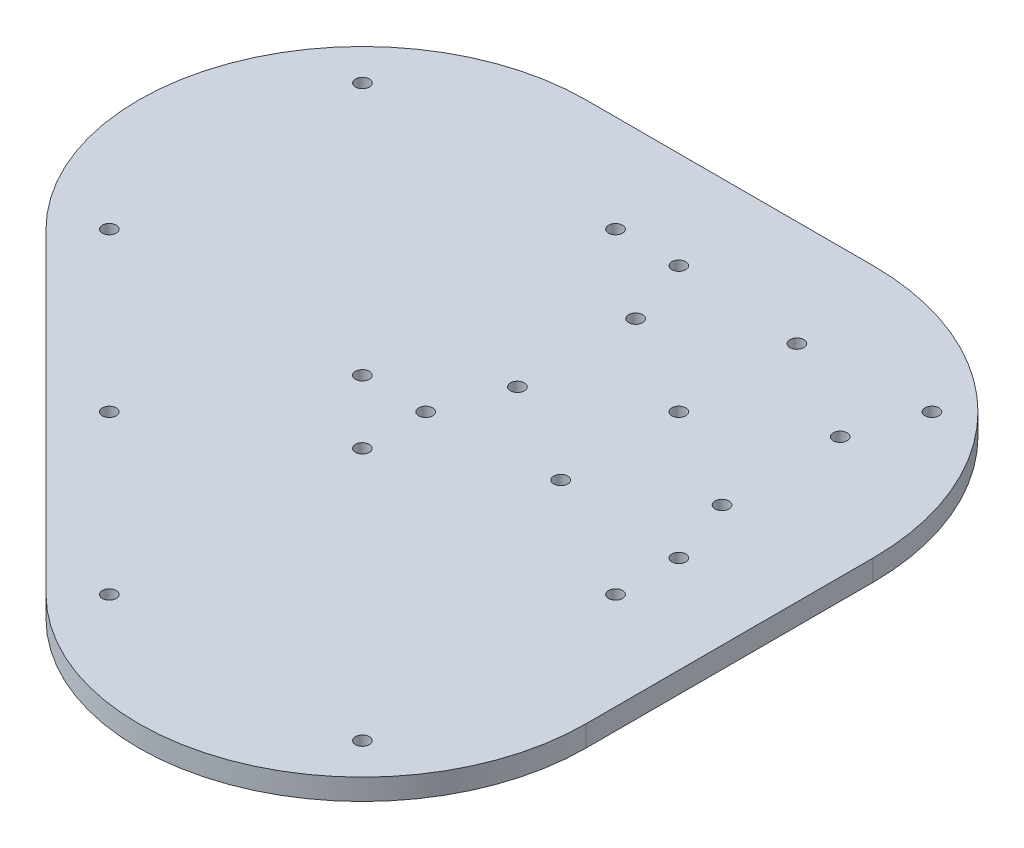
ISO-10303-21;
HEADER;
FILE_DESCRIPTION(('STEP AP214'),'2;1');
FILE_NAME('part.step','',(''),(''),'','','');
FILE_SCHEMA(('AUTOMOTIVE_DESIGN { 1 0 10303 214 1 1 1 1 }'));
ENDSEC;
DATA;
#1=APPLICATION_CONTEXT('core data for automotive mechanical design processes');
#2=APPLICATION_PROTOCOL_DEFINITION('international standard','automotive_design',2000,#1);
#3=PRODUCT_CONTEXT('',#1,'mechanical');
#4=PRODUCT('Part','Part','',(#3));
#5=PRODUCT_RELATED_PRODUCT_CATEGORY('part','',(#4));
#6=PRODUCT_DEFINITION_FORMATION('','',#4);
#7=PRODUCT_DEFINITION_CONTEXT('part definition',#1,'design');
#8=PRODUCT_DEFINITION('design','',#6,#7);
#9=PRODUCT_DEFINITION_SHAPE('','',#8);
#10=(LENGTH_UNIT() NAMED_UNIT(*) SI_UNIT(.MILLI.,.METRE.));
#11=(NAMED_UNIT(*) PLANE_ANGLE_UNIT() SI_UNIT($,.RADIAN.));
#12=(NAMED_UNIT(*) SI_UNIT($,.STERADIAN.) SOLID_ANGLE_UNIT());
#13=UNCERTAINTY_MEASURE_WITH_UNIT(LENGTH_MEASURE(1.E-05),#10,'distance_accuracy_value','');
#14=(GEOMETRIC_REPRESENTATION_CONTEXT(3) GLOBAL_UNCERTAINTY_ASSIGNED_CONTEXT((#13)) GLOBAL_UNIT_ASSIGNED_CONTEXT((#10,
#11,#12)) REPRESENTATION_CONTEXT('',''));
#15=CARTESIAN_POINT('',(0.,0.,0.));
#16=DIRECTION('',(0.,0.,1.));
#17=DIRECTION('',(1.,0.,0.));
#18=AXIS2_PLACEMENT_3D('',#15,#16,#17);
#19=CARTESIAN_POINT('',(37.5,5.,37.5));
#20=DIRECTION('',(0.,1.,0.));
#21=DIRECTION('',(0.,0.,1.));
#22=AXIS2_PLACEMENT_3D('',#19,#20,#21);
#23=PLANE('',#22);
#24=CARTESIAN_POINT('',(-29.9999999999999,5.,30.));
#25=DIRECTION('',(0.,1.,0.));
#26=DIRECTION('',(0.,0.,1.));
#27=AXIS2_PLACEMENT_3D('',#24,#25,#26);
#28=CIRCLE('',#27,1.65);
#29=CARTESIAN_POINT('',(-29.9999999999999,5.,31.65));
#30=VERTEX_POINT('',#29);
#31=EDGE_CURVE('E259',#30,#30,#28,.T.);
#32=ORIENTED_EDGE('',*,*,#31,.F.);
#33=EDGE_LOOP('',(#32));
#34=FACE_BOUND('',#33,.T.);
#35=CARTESIAN_POINT('',(67.5,5.,7.49999999999988));
#36=DIRECTION('',(0.,1.,0.));
#37=DIRECTION('',(0.,0.,-1.));
#38=AXIS2_PLACEMENT_3D('',#35,#36,#37);
#39=CIRCLE('',#38,1.65000000000003);
#40=CARTESIAN_POINT('',(67.5,5.,5.84999999999985));
#41=VERTEX_POINT('',#40);
#42=EDGE_CURVE('E247',#41,#41,#39,.T.);
#43=ORIENTED_EDGE('',*,*,#42,.F.);
#44=EDGE_LOOP('',(#43));
#45=FACE_BOUND('',#44,.T.);
#46=CARTESIAN_POINT('',(7.49999999999999,5.,67.4999999999999));
#47=DIRECTION('',(0.,1.,0.));
#48=DIRECTION('',(0.,0.,-1.));
#49=AXIS2_PLACEMENT_3D('',#46,#47,#48);
#50=CIRCLE('',#49,1.65);
#51=CARTESIAN_POINT('',(7.49999999999999,5.,65.8499999999999));
#52=VERTEX_POINT('',#51);
#53=EDGE_CURVE('E235',#52,#52,#50,.T.);
#54=ORIENTED_EDGE('',*,*,#53,.F.);
#55=EDGE_LOOP('',(#54));
#56=FACE_BOUND('',#55,.T.);
#57=CARTESIAN_POINT('',(-67.4999999999999,5.,-7.49999999999998));
#58=DIRECTION('',(0.,1.,0.));
#59=DIRECTION('',(0.,0.,1.));
#60=AXIS2_PLACEMENT_3D('',#57,#58,#59);
#61=CIRCLE('',#60,1.65);
#62=CARTESIAN_POINT('',(-67.4999999999999,5.,-5.84999999999998));
#63=VERTEX_POINT('',#62);
#64=EDGE_CURVE('E223',#63,#63,#61,.T.);
#65=ORIENTED_EDGE('',*,*,#64,.F.);
#66=EDGE_LOOP('',(#65));
#67=FACE_BOUND('',#66,.T.);
#68=CARTESIAN_POINT('',(-67.4999999999999,5.,-67.5));
#69=DIRECTION('',(0.,1.,0.));
#70=DIRECTION('',(0.,0.,1.));
#71=AXIS2_PLACEMENT_3D('',#68,#69,#70);
#72=CIRCLE('',#71,1.65);
#73=CARTESIAN_POINT('',(-67.4999999999999,5.,-65.85));
#74=VERTEX_POINT('',#73);
#75=EDGE_CURVE('E211',#74,#74,#72,.T.);
#76=ORIENTED_EDGE('',*,*,#75,.F.);
#77=EDGE_LOOP('',(#76));
#78=FACE_BOUND('',#77,.T.);
#79=CARTESIAN_POINT('',(37.5,5.,-37.5));
#80=DIRECTION('',(0.,1.,0.));
#81=DIRECTION('',(0.,0.,1.));
#82=AXIS2_PLACEMENT_3D('',#79,#80,#81);
#83=CIRCLE('',#82,1.65);
#84=CARTESIAN_POINT('',(37.5,5.,-35.85));
#85=VERTEX_POINT('',#84);
#86=EDGE_CURVE('E199',#85,#85,#83,.T.);
#87=ORIENTED_EDGE('',*,*,#86,.F.);
#88=EDGE_LOOP('',(#87));
#89=FACE_BOUND('',#88,.T.);
#90=CARTESIAN_POINT('',(67.5,5.,-7.49999999999995));
#91=DIRECTION('',(0.,1.,0.));
#92=DIRECTION('',(0.,0.,1.));
#93=AXIS2_PLACEMENT_3D('',#90,#91,#92);
#94=CIRCLE('',#93,1.65);
#95=CARTESIAN_POINT('',(67.5,5.,-5.84999999999995));
#96=VERTEX_POINT('',#95);
#97=EDGE_CURVE('E187',#96,#96,#94,.T.);
#98=ORIENTED_EDGE('',*,*,#97,.F.);
#99=EDGE_LOOP('',(#98));
#100=FACE_BOUND('',#99,.T.);
#101=CARTESIAN_POINT('',(13.2512886940357,5.,-51.4999999999999));
#102=DIRECTION('',(0.,1.,0.));
#103=DIRECTION('',(0.,0.,1.));
#104=AXIS2_PLACEMENT_3D('',#101,#102,#103);
#105=CIRCLE('',#104,1.65);
#106=CARTESIAN_POINT('',(13.2512886940357,5.,-49.8499999999999));
#107=VERTEX_POINT('',#106);
#108=EDGE_CURVE('E175',#107,#107,#105,.T.);
#109=ORIENTED_EDGE('',*,*,#108,.F.);
#110=EDGE_LOOP('',(#109));
#111=FACE_BOUND('',#110,.T.);
#112=CARTESIAN_POINT('',(37.5,5.,-9.49999999999994));
#113=DIRECTION('',(0.,1.,0.));
#114=DIRECTION('',(0.,0.,1.));
#115=AXIS2_PLACEMENT_3D('',#112,#113,#114);
#116=CIRCLE('',#115,1.65);
#117=CARTESIAN_POINT('',(37.5,5.,-7.84999999999994));
#118=VERTEX_POINT('',#117);
#119=EDGE_CURVE('E163',#118,#118,#116,.T.);
#120=ORIENTED_EDGE('',*,*,#119,.F.);
#121=EDGE_LOOP('',(#120));
#122=FACE_BOUND('',#121,.T.);
#123=CARTESIAN_POINT('',(61.7487113059643,5.,-51.5));
#124=DIRECTION('',(0.,1.,0.));
#125=DIRECTION('',(0.,0.,1.));
#126=AXIS2_PLACEMENT_3D('',#123,#124,#125);
#127=CIRCLE('',#126,1.65000000000002);
#128=CARTESIAN_POINT('',(61.7487113059643,5.,-49.8499999999999));
#129=VERTEX_POINT('',#128);
#130=EDGE_CURVE('E131',#129,#129,#127,.T.);
#131=ORIENTED_EDGE('',*,*,#130,.F.);
#132=EDGE_LOOP('',(#131));
#133=FACE_BOUND('',#132,.T.);
#134=CARTESIAN_POINT('',(37.5,5.,37.5));
#135=DIRECTION('',(0.,1.,0.));
#136=DIRECTION('',(0.,0.,1.));
#137=AXIS2_PLACEMENT_3D('',#134,#135,#136);
#138=CIRCLE('',#137,53.0330085889911);
#139=CARTESIAN_POINT('',(0.,5.,75.));
#140=VERTEX_POINT('',#139);
#141=CARTESIAN_POINT('',(90.533008588991,5.,37.5));
#142=VERTEX_POINT('',#141);
#143=EDGE_CURVE('E56',#140,#142,#138,.T.);
#144=ORIENTED_EDGE('',*,*,#143,.T.);
#145=DIRECTION('',(0.,0.,-1.));
#146=VECTOR('',#145,1.);
#147=CARTESIAN_POINT('',(90.533008588991,5.,37.5));
#148=LINE('',#147,#146);
#149=CARTESIAN_POINT('',(90.5330085889911,5.,-30.5330085889911));
#150=VERTEX_POINT('',#149);
#151=EDGE_CURVE('E93',#142,#150,#148,.T.);
#152=ORIENTED_EDGE('',*,*,#151,.T.);
#153=CARTESIAN_POINT('',(30.5330085889911,5.,-30.5330085889911));
#154=DIRECTION('',(0.,1.,0.));
#155=DIRECTION('',(0.,0.,1.));
#156=AXIS2_PLACEMENT_3D('',#153,#154,#155);
#157=CIRCLE('',#156,60.);
#158=CARTESIAN_POINT('',(30.5330085889911,5.,-90.5330085889911));
#159=VERTEX_POINT('',#158);
#160=EDGE_CURVE('E107',#150,#159,#157,.T.);
#161=ORIENTED_EDGE('',*,*,#160,.T.);
#162=DIRECTION('',(-1.,0.,0.));
#163=VECTOR('',#162,1.);
#164=CARTESIAN_POINT('',(-37.4999999999999,5.,-90.533008588991));
#165=LINE('',#164,#163);
#166=CARTESIAN_POINT('',(-37.4999999999999,5.,-90.5330085889911));
#167=VERTEX_POINT('',#166);
#168=EDGE_CURVE('E101',#159,#167,#165,.T.);
#169=ORIENTED_EDGE('',*,*,#168,.T.);
#170=CARTESIAN_POINT('',(-37.4999999999999,5.,-37.5));
#171=DIRECTION('',(0.,1.,0.));
#172=DIRECTION('',(0.,0.,-1.));
#173=AXIS2_PLACEMENT_3D('',#170,#171,#172);
#174=CIRCLE('',#173,53.0330085889911);
#175=CARTESIAN_POINT('',(-75.,5.,0.));
#176=VERTEX_POINT('',#175);
#177=EDGE_CURVE('E105',#167,#176,#174,.T.);
#178=ORIENTED_EDGE('',*,*,#177,.T.);
#179=DIRECTION('',(0.707106781186548,0.,0.707106781186548));
#180=VECTOR('',#179,1.);
#181=CARTESIAN_POINT('',(-75.,5.,0.));
#182=LINE('',#181,#180);
#183=EDGE_CURVE('E122',#176,#140,#182,.T.);
#184=ORIENTED_EDGE('',*,*,#183,.T.);
#185=EDGE_LOOP('',(#144,#152,#161,#169,#178,#184));
#186=FACE_BOUND('',#185,.T.);
#187=CARTESIAN_POINT('',(61.7487113059643,5.,-23.5));
#188=DIRECTION('',(0.,1.,0.));
#189=DIRECTION('',(0.,0.,1.));
#190=AXIS2_PLACEMENT_3D('',#187,#188,#189);
#191=CIRCLE('',#190,1.65000000000001);
#192=CARTESIAN_POINT('',(61.7487113059643,5.,-21.8499999999999));
#193=VERTEX_POINT('',#192);
#194=EDGE_CURVE('E157',#193,#193,#191,.T.);
#195=ORIENTED_EDGE('',*,*,#194,.F.);
#196=EDGE_LOOP('',(#195));
#197=FACE_BOUND('',#196,.T.);
#198=CARTESIAN_POINT('',(13.2512886940357,5.,-23.4999999999999));
#199=DIRECTION('',(0.,1.,0.));
#200=DIRECTION('',(0.,0.,1.));
#201=AXIS2_PLACEMENT_3D('',#198,#199,#200);
#202=CIRCLE('',#201,1.65);
#203=CARTESIAN_POINT('',(13.2512886940357,5.,-21.8499999999999));
#204=VERTEX_POINT('',#203);
#205=EDGE_CURVE('E169',#204,#204,#202,.T.);
#206=ORIENTED_EDGE('',*,*,#205,.F.);
#207=EDGE_LOOP('',(#206));
#208=FACE_BOUND('',#207,.T.);
#209=CARTESIAN_POINT('',(67.5,5.,-67.5));
#210=DIRECTION('',(0.,1.,0.));
#211=DIRECTION('',(0.,0.,-1.));
#212=AXIS2_PLACEMENT_3D('',#209,#210,#211);
#213=CIRCLE('',#212,1.65);
#214=CARTESIAN_POINT('',(67.5,5.,-69.15));
#215=VERTEX_POINT('',#214);
#216=EDGE_CURVE('E181',#215,#215,#213,.T.);
#217=ORIENTED_EDGE('',*,*,#216,.F.);
#218=EDGE_LOOP('',(#217));
#219=FACE_BOUND('',#218,.T.);
#220=CARTESIAN_POINT('',(7.49999999999997,5.,-7.49999999999995));
#221=DIRECTION('',(0.,1.,0.));
#222=DIRECTION('',(0.,0.,-1.));
#223=AXIS2_PLACEMENT_3D('',#220,#221,#222);
#224=CIRCLE('',#223,1.65);
#225=CARTESIAN_POINT('',(7.49999999999997,5.,-9.14999999999995));
#226=VERTEX_POINT('',#225);
#227=EDGE_CURVE('E193',#226,#226,#224,.T.);
#228=ORIENTED_EDGE('',*,*,#227,.F.);
#229=EDGE_LOOP('',(#228));
#230=FACE_BOUND('',#229,.T.);
#231=CARTESIAN_POINT('',(7.49999999999997,5.,-67.5));
#232=DIRECTION('',(0.,1.,0.));
#233=DIRECTION('',(0.,0.,1.));
#234=AXIS2_PLACEMENT_3D('',#231,#232,#233);
#235=CIRCLE('',#234,1.65);
#236=CARTESIAN_POINT('',(7.49999999999997,5.,-65.85));
#237=VERTEX_POINT('',#236);
#238=EDGE_CURVE('E205',#237,#237,#235,.T.);
#239=ORIENTED_EDGE('',*,*,#238,.F.);
#240=EDGE_LOOP('',(#239));
#241=FACE_BOUND('',#240,.T.);
#242=CARTESIAN_POINT('',(-7.49999999999988,5.,-67.5));
#243=DIRECTION('',(0.,1.,0.));
#244=DIRECTION('',(0.,0.,1.));
#245=AXIS2_PLACEMENT_3D('',#242,#243,#244);
#246=CIRCLE('',#245,1.65);
#247=CARTESIAN_POINT('',(-7.49999999999988,5.,-65.85));
#248=VERTEX_POINT('',#247);
#249=EDGE_CURVE('E217',#248,#248,#246,.T.);
#250=ORIENTED_EDGE('',*,*,#249,.F.);
#251=EDGE_LOOP('',(#250));
#252=FACE_BOUND('',#251,.T.);
#253=CARTESIAN_POINT('',(-7.49999999999988,5.,-7.49999999999998));
#254=DIRECTION('',(0.,1.,0.));
#255=DIRECTION('',(0.,0.,1.));
#256=AXIS2_PLACEMENT_3D('',#253,#254,#255);
#257=CIRCLE('',#256,1.65);
#258=CARTESIAN_POINT('',(-7.49999999999988,5.,-5.84999999999998));
#259=VERTEX_POINT('',#258);
#260=EDGE_CURVE('E229',#259,#259,#257,.T.);
#261=ORIENTED_EDGE('',*,*,#260,.F.);
#262=EDGE_LOOP('',(#261));
#263=FACE_BOUND('',#262,.T.);
#264=CARTESIAN_POINT('',(7.50000000000001,5.,7.49999999999991));
#265=DIRECTION('',(0.,1.,0.));
#266=DIRECTION('',(0.,0.,-1.));
#267=AXIS2_PLACEMENT_3D('',#264,#265,#266);
#268=CIRCLE('',#267,1.65);
#269=CARTESIAN_POINT('',(7.50000000000001,5.,5.8499999999999));
#270=VERTEX_POINT('',#269);
#271=EDGE_CURVE('E241',#270,#270,#268,.T.);
#272=ORIENTED_EDGE('',*,*,#271,.F.);
#273=EDGE_LOOP('',(#272));
#274=FACE_BOUND('',#273,.T.);
#275=CARTESIAN_POINT('',(67.5,5.,67.4999999999999));
#276=DIRECTION('',(0.,1.,0.));
#277=DIRECTION('',(0.,0.,-1.));
#278=AXIS2_PLACEMENT_3D('',#275,#276,#277);
#279=CIRCLE('',#278,1.65);
#280=CARTESIAN_POINT('',(67.5,5.,65.8499999999999));
#281=VERTEX_POINT('',#280);
#282=EDGE_CURVE('E253',#281,#281,#279,.T.);
#283=ORIENTED_EDGE('',*,*,#282,.F.);
#284=EDGE_LOOP('',(#283));
#285=FACE_BOUND('',#284,.T.);
#286=CARTESIAN_POINT('',(37.5,5.,-65.5));
#287=DIRECTION('',(0.,1.,0.));
#288=DIRECTION('',(0.,0.,1.));
#289=AXIS2_PLACEMENT_3D('',#286,#287,#288);
#290=CIRCLE('',#289,1.65);
#291=CARTESIAN_POINT('',(37.5,5.,-63.85));
#292=VERTEX_POINT('',#291);
#293=EDGE_CURVE('E265',#292,#292,#290,.T.);
#294=ORIENTED_EDGE('',*,*,#293,.F.);
#295=EDGE_LOOP('',(#294));
#296=FACE_BOUND('',#295,.T.);
#297=ADVANCED_FACE('F39',(#34,#45,#56,#67,#78,#89,#100,#111,#122,#133,#186,#197,#208,#219,#230,
#241,#252,#263,#274,#285,#296),#23,.T.);
#298=CARTESIAN_POINT('',(37.5,0.,37.5));
#299=DIRECTION('',(0.,1.,0.));
#300=DIRECTION('',(0.,0.,1.));
#301=AXIS2_PLACEMENT_3D('',#298,#299,#300);
#302=PLANE('',#301);
#303=DIRECTION('',(0.,0.,-1.));
#304=VECTOR('',#303,1.);
#305=CARTESIAN_POINT('',(90.533008588991,0.,37.5));
#306=LINE('',#305,#304);
#307=CARTESIAN_POINT('',(90.533008588991,0.,37.5));
#308=VERTEX_POINT('',#307);
#309=CARTESIAN_POINT('',(90.5330085889911,0.,-30.5330085889911));
#310=VERTEX_POINT('',#309);
#311=EDGE_CURVE('E128',#308,#310,#306,.T.);
#312=ORIENTED_EDGE('',*,*,#311,.F.);
#313=CARTESIAN_POINT('',(37.5,0.,37.5));
#314=DIRECTION('',(0.,1.,0.));
#315=DIRECTION('',(0.,0.,1.));
#316=AXIS2_PLACEMENT_3D('',#313,#314,#315);
#317=CIRCLE('',#316,53.0330085889911);
#318=CARTESIAN_POINT('',(0.,0.,75.));
#319=VERTEX_POINT('',#318);
#320=EDGE_CURVE('E136',#319,#308,#317,.T.);
#321=ORIENTED_EDGE('',*,*,#320,.F.);
#322=DIRECTION('',(0.707106781186548,0.,0.707106781186548));
#323=VECTOR('',#322,1.);
#324=CARTESIAN_POINT('',(-75.,0.,0.));
#325=LINE('',#324,#323);
#326=CARTESIAN_POINT('',(-75.,0.,0.));
#327=VERTEX_POINT('',#326);
#328=EDGE_CURVE('E86',#327,#319,#325,.T.);
#329=ORIENTED_EDGE('',*,*,#328,.F.);
#330=CARTESIAN_POINT('',(-37.4999999999999,0.,-37.5));
#331=DIRECTION('',(0.,1.,0.));
#332=DIRECTION('',(0.,0.,-1.));
#333=AXIS2_PLACEMENT_3D('',#330,#331,#332);
#334=CIRCLE('',#333,53.0330085889911);
#335=CARTESIAN_POINT('',(-37.4999999999999,0.,-90.5330085889911));
#336=VERTEX_POINT('',#335);
#337=EDGE_CURVE('E79',#336,#327,#334,.T.);
#338=ORIENTED_EDGE('',*,*,#337,.F.);
#339=DIRECTION('',(-1.,0.,0.));
#340=VECTOR('',#339,1.);
#341=CARTESIAN_POINT('',(-37.4999999999999,0.,-90.533008588991));
#342=LINE('',#341,#340);
#343=CARTESIAN_POINT('',(30.5330085889911,0.,-90.5330085889911));
#344=VERTEX_POINT('',#343);
#345=EDGE_CURVE('E116',#344,#336,#342,.T.);
#346=ORIENTED_EDGE('',*,*,#345,.F.);
#347=CARTESIAN_POINT('',(30.5330085889911,0.,-30.5330085889911));
#348=DIRECTION('',(0.,1.,0.));
#349=DIRECTION('',(0.,0.,1.));
#350=AXIS2_PLACEMENT_3D('',#347,#348,#349);
#351=CIRCLE('',#350,60.);
#352=EDGE_CURVE('E130',#310,#344,#351,.T.);
#353=ORIENTED_EDGE('',*,*,#352,.F.);
#354=EDGE_LOOP('',(#312,#321,#329,#338,#346,#353));
#355=FACE_BOUND('',#354,.T.);
#356=CARTESIAN_POINT('',(61.7487113059643,0.,-51.5));
#357=DIRECTION('',(0.,1.,0.));
#358=DIRECTION('',(0.,0.,1.));
#359=AXIS2_PLACEMENT_3D('',#356,#357,#358);
#360=CIRCLE('',#359,1.65000000000002);
#361=CARTESIAN_POINT('',(61.7487113059643,0.,-49.8499999999999));
#362=VERTEX_POINT('',#361);
#363=EDGE_CURVE('E154',#362,#362,#360,.T.);
#364=ORIENTED_EDGE('',*,*,#363,.T.);
#365=EDGE_LOOP('',(#364));
#366=FACE_BOUND('',#365,.T.);
#367=CARTESIAN_POINT('',(61.7487113059643,0.,-23.5));
#368=DIRECTION('',(0.,1.,0.));
#369=DIRECTION('',(0.,0.,1.));
#370=AXIS2_PLACEMENT_3D('',#367,#368,#369);
#371=CIRCLE('',#370,1.65000000000001);
#372=CARTESIAN_POINT('',(61.7487113059643,0.,-21.8499999999999));
#373=VERTEX_POINT('',#372);
#374=EDGE_CURVE('E160',#373,#373,#371,.T.);
#375=ORIENTED_EDGE('',*,*,#374,.T.);
#376=EDGE_LOOP('',(#375));
#377=FACE_BOUND('',#376,.T.);
#378=CARTESIAN_POINT('',(37.5,0.,-9.49999999999994));
#379=DIRECTION('',(0.,1.,0.));
#380=DIRECTION('',(0.,0.,1.));
#381=AXIS2_PLACEMENT_3D('',#378,#379,#380);
#382=CIRCLE('',#381,1.65);
#383=CARTESIAN_POINT('',(37.5,0.,-7.84999999999994));
#384=VERTEX_POINT('',#383);
#385=EDGE_CURVE('E166',#384,#384,#382,.T.);
#386=ORIENTED_EDGE('',*,*,#385,.T.);
#387=EDGE_LOOP('',(#386));
#388=FACE_BOUND('',#387,.T.);
#389=CARTESIAN_POINT('',(13.2512886940357,0.,-23.4999999999999));
#390=DIRECTION('',(0.,1.,0.));
#391=DIRECTION('',(0.,0.,1.));
#392=AXIS2_PLACEMENT_3D('',#389,#390,#391);
#393=CIRCLE('',#392,1.65);
#394=CARTESIAN_POINT('',(13.2512886940357,0.,-21.8499999999999));
#395=VERTEX_POINT('',#394);
#396=EDGE_CURVE('E172',#395,#395,#393,.T.);
#397=ORIENTED_EDGE('',*,*,#396,.T.);
#398=EDGE_LOOP('',(#397));
#399=FACE_BOUND('',#398,.T.);
#400=CARTESIAN_POINT('',(13.2512886940357,0.,-51.4999999999999));
#401=DIRECTION('',(0.,1.,0.));
#402=DIRECTION('',(0.,0.,1.));
#403=AXIS2_PLACEMENT_3D('',#400,#401,#402);
#404=CIRCLE('',#403,1.65);
#405=CARTESIAN_POINT('',(13.2512886940357,0.,-49.8499999999999));
#406=VERTEX_POINT('',#405);
#407=EDGE_CURVE('E178',#406,#406,#404,.T.);
#408=ORIENTED_EDGE('',*,*,#407,.T.);
#409=EDGE_LOOP('',(#408));
#410=FACE_BOUND('',#409,.T.);
#411=CARTESIAN_POINT('',(67.5,0.,-67.5));
#412=DIRECTION('',(0.,1.,0.));
#413=DIRECTION('',(0.,0.,-1.));
#414=AXIS2_PLACEMENT_3D('',#411,#412,#413);
#415=CIRCLE('',#414,1.65);
#416=CARTESIAN_POINT('',(67.5,0.,-69.15));
#417=VERTEX_POINT('',#416);
#418=EDGE_CURVE('E184',#417,#417,#415,.T.);
#419=ORIENTED_EDGE('',*,*,#418,.T.);
#420=EDGE_LOOP('',(#419));
#421=FACE_BOUND('',#420,.T.);
#422=CARTESIAN_POINT('',(67.5,0.,-7.49999999999995));
#423=DIRECTION('',(0.,1.,0.));
#424=DIRECTION('',(0.,0.,1.));
#425=AXIS2_PLACEMENT_3D('',#422,#423,#424);
#426=CIRCLE('',#425,1.65);
#427=CARTESIAN_POINT('',(67.5,0.,-5.84999999999995));
#428=VERTEX_POINT('',#427);
#429=EDGE_CURVE('E190',#428,#428,#426,.T.);
#430=ORIENTED_EDGE('',*,*,#429,.T.);
#431=EDGE_LOOP('',(#430));
#432=FACE_BOUND('',#431,.T.);
#433=CARTESIAN_POINT('',(7.49999999999997,0.,-7.49999999999995));
#434=DIRECTION('',(0.,1.,0.));
#435=DIRECTION('',(0.,0.,-1.));
#436=AXIS2_PLACEMENT_3D('',#433,#434,#435);
#437=CIRCLE('',#436,1.65);
#438=CARTESIAN_POINT('',(7.49999999999997,0.,-9.14999999999995));
#439=VERTEX_POINT('',#438);
#440=EDGE_CURVE('E196',#439,#439,#437,.T.);
#441=ORIENTED_EDGE('',*,*,#440,.T.);
#442=EDGE_LOOP('',(#441));
#443=FACE_BOUND('',#442,.T.);
#444=CARTESIAN_POINT('',(37.5,0.,-37.5));
#445=DIRECTION('',(0.,1.,0.));
#446=DIRECTION('',(0.,0.,1.));
#447=AXIS2_PLACEMENT_3D('',#444,#445,#446);
#448=CIRCLE('',#447,1.65);
#449=CARTESIAN_POINT('',(37.5,0.,-35.85));
#450=VERTEX_POINT('',#449);
#451=EDGE_CURVE('E202',#450,#450,#448,.T.);
#452=ORIENTED_EDGE('',*,*,#451,.T.);
#453=EDGE_LOOP('',(#452));
#454=FACE_BOUND('',#453,.T.);
#455=CARTESIAN_POINT('',(7.49999999999997,0.,-67.5));
#456=DIRECTION('',(0.,1.,0.));
#457=DIRECTION('',(0.,0.,1.));
#458=AXIS2_PLACEMENT_3D('',#455,#456,#457);
#459=CIRCLE('',#458,1.65);
#460=CARTESIAN_POINT('',(7.49999999999997,0.,-65.85));
#461=VERTEX_POINT('',#460);
#462=EDGE_CURVE('E208',#461,#461,#459,.T.);
#463=ORIENTED_EDGE('',*,*,#462,.T.);
#464=EDGE_LOOP('',(#463));
#465=FACE_BOUND('',#464,.T.);
#466=CARTESIAN_POINT('',(-67.4999999999999,0.,-67.5));
#467=DIRECTION('',(0.,1.,0.));
#468=DIRECTION('',(0.,0.,1.));
#469=AXIS2_PLACEMENT_3D('',#466,#467,#468);
#470=CIRCLE('',#469,1.65);
#471=CARTESIAN_POINT('',(-67.4999999999999,0.,-65.85));
#472=VERTEX_POINT('',#471);
#473=EDGE_CURVE('E214',#472,#472,#470,.T.);
#474=ORIENTED_EDGE('',*,*,#473,.T.);
#475=EDGE_LOOP('',(#474));
#476=FACE_BOUND('',#475,.T.);
#477=CARTESIAN_POINT('',(-7.49999999999988,0.,-67.5));
#478=DIRECTION('',(0.,1.,0.));
#479=DIRECTION('',(0.,0.,1.));
#480=AXIS2_PLACEMENT_3D('',#477,#478,#479);
#481=CIRCLE('',#480,1.65);
#482=CARTESIAN_POINT('',(-7.49999999999988,0.,-65.85));
#483=VERTEX_POINT('',#482);
#484=EDGE_CURVE('E220',#483,#483,#481,.T.);
#485=ORIENTED_EDGE('',*,*,#484,.T.);
#486=EDGE_LOOP('',(#485));
#487=FACE_BOUND('',#486,.T.);
#488=CARTESIAN_POINT('',(-67.4999999999999,0.,-7.49999999999998));
#489=DIRECTION('',(0.,1.,0.));
#490=DIRECTION('',(0.,0.,1.));
#491=AXIS2_PLACEMENT_3D('',#488,#489,#490);
#492=CIRCLE('',#491,1.65);
#493=CARTESIAN_POINT('',(-67.4999999999999,0.,-5.84999999999998));
#494=VERTEX_POINT('',#493);
#495=EDGE_CURVE('E226',#494,#494,#492,.T.);
#496=ORIENTED_EDGE('',*,*,#495,.T.);
#497=EDGE_LOOP('',(#496));
#498=FACE_BOUND('',#497,.T.);
#499=CARTESIAN_POINT('',(-7.49999999999988,0.,-7.49999999999998));
#500=DIRECTION('',(0.,1.,0.));
#501=DIRECTION('',(0.,0.,1.));
#502=AXIS2_PLACEMENT_3D('',#499,#500,#501);
#503=CIRCLE('',#502,1.65);
#504=CARTESIAN_POINT('',(-7.49999999999988,0.,-5.84999999999998));
#505=VERTEX_POINT('',#504);
#506=EDGE_CURVE('E232',#505,#505,#503,.T.);
#507=ORIENTED_EDGE('',*,*,#506,.T.);
#508=EDGE_LOOP('',(#507));
#509=FACE_BOUND('',#508,.T.);
#510=CARTESIAN_POINT('',(7.49999999999999,0.,67.4999999999999));
#511=DIRECTION('',(0.,1.,0.));
#512=DIRECTION('',(0.,0.,-1.));
#513=AXIS2_PLACEMENT_3D('',#510,#511,#512);
#514=CIRCLE('',#513,1.65);
#515=CARTESIAN_POINT('',(7.49999999999999,0.,65.8499999999999));
#516=VERTEX_POINT('',#515);
#517=EDGE_CURVE('E238',#516,#516,#514,.T.);
#518=ORIENTED_EDGE('',*,*,#517,.T.);
#519=EDGE_LOOP('',(#518));
#520=FACE_BOUND('',#519,.T.);
#521=CARTESIAN_POINT('',(7.50000000000001,0.,7.49999999999991));
#522=DIRECTION('',(0.,1.,0.));
#523=DIRECTION('',(0.,0.,-1.));
#524=AXIS2_PLACEMENT_3D('',#521,#522,#523);
#525=CIRCLE('',#524,1.65);
#526=CARTESIAN_POINT('',(7.50000000000001,0.,5.8499999999999));
#527=VERTEX_POINT('',#526);
#528=EDGE_CURVE('E244',#527,#527,#525,.T.);
#529=ORIENTED_EDGE('',*,*,#528,.T.);
#530=EDGE_LOOP('',(#529));
#531=FACE_BOUND('',#530,.T.);
#532=CARTESIAN_POINT('',(67.5,0.,7.49999999999988));
#533=DIRECTION('',(0.,1.,0.));
#534=DIRECTION('',(0.,0.,-1.));
#535=AXIS2_PLACEMENT_3D('',#532,#533,#534);
#536=CIRCLE('',#535,1.65000000000003);
#537=CARTESIAN_POINT('',(67.5,0.,5.84999999999985));
#538=VERTEX_POINT('',#537);
#539=EDGE_CURVE('E250',#538,#538,#536,.T.);
#540=ORIENTED_EDGE('',*,*,#539,.T.);
#541=EDGE_LOOP('',(#540));
#542=FACE_BOUND('',#541,.T.);
#543=CARTESIAN_POINT('',(67.5,0.,67.4999999999999));
#544=DIRECTION('',(0.,1.,0.));
#545=DIRECTION('',(0.,0.,-1.));
#546=AXIS2_PLACEMENT_3D('',#543,#544,#545);
#547=CIRCLE('',#546,1.65);
#548=CARTESIAN_POINT('',(67.5,0.,65.8499999999999));
#549=VERTEX_POINT('',#548);
#550=EDGE_CURVE('E256',#549,#549,#547,.T.);
#551=ORIENTED_EDGE('',*,*,#550,.T.);
#552=EDGE_LOOP('',(#551));
#553=FACE_BOUND('',#552,.T.);
#554=CARTESIAN_POINT('',(-29.9999999999999,0.,30.));
#555=DIRECTION('',(0.,1.,0.));
#556=DIRECTION('',(0.,0.,1.));
#557=AXIS2_PLACEMENT_3D('',#554,#555,#556);
#558=CIRCLE('',#557,1.65);
#559=CARTESIAN_POINT('',(-29.9999999999999,0.,31.65));
#560=VERTEX_POINT('',#559);
#561=EDGE_CURVE('E262',#560,#560,#558,.T.);
#562=ORIENTED_EDGE('',*,*,#561,.T.);
#563=EDGE_LOOP('',(#562));
#564=FACE_BOUND('',#563,.T.);
#565=CARTESIAN_POINT('',(37.5,0.,-65.5));
#566=DIRECTION('',(0.,1.,0.));
#567=DIRECTION('',(0.,0.,1.));
#568=AXIS2_PLACEMENT_3D('',#565,#566,#567);
#569=CIRCLE('',#568,1.65);
#570=CARTESIAN_POINT('',(37.5,0.,-63.85));
#571=VERTEX_POINT('',#570);
#572=EDGE_CURVE('E268',#571,#571,#569,.T.);
#573=ORIENTED_EDGE('',*,*,#572,.T.);
#574=EDGE_LOOP('',(#573));
#575=FACE_BOUND('',#574,.T.);
#576=ADVANCED_FACE('F146',(#355,#366,#377,#388,#399,#410,#421,#432,#443,#454,#465,#476,#487,
#498,#509,#520,#531,#542,#553,#564,#575),#302,.F.);
#577=CARTESIAN_POINT('',(90.533008588991,5.,37.5));
#578=DIRECTION('',(-1.,0.,0.));
#579=DIRECTION('',(0.,0.,1.));
#580=AXIS2_PLACEMENT_3D('',#577,#578,#579);
#581=PLANE('',#580);
#582=ORIENTED_EDGE('',*,*,#311,.T.);
#583=DIRECTION('',(0.,-1.,0.));
#584=VECTOR('',#583,1.);
#585=CARTESIAN_POINT('',(90.5330085889911,5.,-30.5330085889911));
#586=LINE('',#585,#584);
#587=EDGE_CURVE('E48',#150,#310,#586,.T.);
#588=ORIENTED_EDGE('',*,*,#587,.F.);
#589=ORIENTED_EDGE('',*,*,#151,.F.);
#590=DIRECTION('',(0.,-1.,0.));
#591=VECTOR('',#590,1.);
#592=CARTESIAN_POINT('',(90.533008588991,5.,37.5));
#593=LINE('',#592,#591);
#594=EDGE_CURVE('E11',#142,#308,#593,.T.);
#595=ORIENTED_EDGE('',*,*,#594,.T.);
#596=EDGE_LOOP('',(#582,#588,#589,#595));
#597=FACE_BOUND('',#596,.T.);
#598=ADVANCED_FACE('F41',(#597),#581,.F.);
#599=CARTESIAN_POINT('',(30.5330085889911,5.,-30.5330085889911));
#600=DIRECTION('',(0.,-1.,0.));
#601=DIRECTION('',(0.,0.,-1.));
#602=AXIS2_PLACEMENT_3D('',#599,#600,#601);
#603=CYLINDRICAL_SURFACE('',#602,60.);
#604=ORIENTED_EDGE('',*,*,#352,.T.);
#605=DIRECTION('',(0.,-1.,0.));
#606=VECTOR('',#605,1.);
#607=CARTESIAN_POINT('',(30.5330085889911,5.,-90.5330085889911));
#608=LINE('',#607,#606);
#609=EDGE_CURVE('E117',#159,#344,#608,.T.);
#610=ORIENTED_EDGE('',*,*,#609,.F.);
#611=ORIENTED_EDGE('',*,*,#160,.F.);
#612=ORIENTED_EDGE('',*,*,#587,.T.);
#613=EDGE_LOOP('',(#604,#610,#611,#612));
#614=FACE_BOUND('',#613,.T.);
#615=ADVANCED_FACE('F143',(#614),#603,.T.);
#616=CARTESIAN_POINT('',(-37.4999999999999,5.,-90.533008588991));
#617=DIRECTION('',(0.,0.,1.));
#618=DIRECTION('',(1.,0.,0.));
#619=AXIS2_PLACEMENT_3D('',#616,#617,#618);
#620=PLANE('',#619);
#621=ORIENTED_EDGE('',*,*,#345,.T.);
#622=DIRECTION('',(0.,-1.,0.));
#623=VECTOR('',#622,1.);
#624=CARTESIAN_POINT('',(-37.4999999999999,5.,-90.5330085889911));
#625=LINE('',#624,#623);
#626=EDGE_CURVE('E113',#167,#336,#625,.T.);
#627=ORIENTED_EDGE('',*,*,#626,.F.);
#628=ORIENTED_EDGE('',*,*,#168,.F.);
#629=ORIENTED_EDGE('',*,*,#609,.T.);
#630=EDGE_LOOP('',(#621,#627,#628,#629));
#631=FACE_BOUND('',#630,.T.);
#632=ADVANCED_FACE('F114',(#631),#620,.F.);
#633=CARTESIAN_POINT('',(-37.4999999999999,5.,-37.5));
#634=DIRECTION('',(0.,-1.,0.));
#635=DIRECTION('',(0.,0.,-1.));
#636=AXIS2_PLACEMENT_3D('',#633,#634,#635);
#637=CYLINDRICAL_SURFACE('',#636,53.0330085889911);
#638=ORIENTED_EDGE('',*,*,#337,.T.);
#639=DIRECTION('',(0.,-1.,0.));
#640=VECTOR('',#639,1.);
#641=CARTESIAN_POINT('',(-75.,5.,0.));
#642=LINE('',#641,#640);
#643=EDGE_CURVE('E118',#176,#327,#642,.T.);
#644=ORIENTED_EDGE('',*,*,#643,.F.);
#645=ORIENTED_EDGE('',*,*,#177,.F.);
#646=ORIENTED_EDGE('',*,*,#626,.T.);
#647=EDGE_LOOP('',(#638,#644,#645,#646));
#648=FACE_BOUND('',#647,.T.);
#649=ADVANCED_FACE('F120',(#648),#637,.T.);
#650=CARTESIAN_POINT('',(-75.,5.,0.));
#651=DIRECTION('',(0.707106781186548,0.,-0.707106781186548));
#652=DIRECTION('',(-0.707106781186548,0.,-0.707106781186548));
#653=AXIS2_PLACEMENT_3D('',#650,#651,#652);
#654=PLANE('',#653);
#655=ORIENTED_EDGE('',*,*,#328,.T.);
#656=DIRECTION('',(0.,-1.,0.));
#657=VECTOR('',#656,1.);
#658=CARTESIAN_POINT('',(0.,5.,75.));
#659=LINE('',#658,#657);
#660=EDGE_CURVE('E124',#140,#319,#659,.T.);
#661=ORIENTED_EDGE('',*,*,#660,.F.);
#662=ORIENTED_EDGE('',*,*,#183,.F.);
#663=ORIENTED_EDGE('',*,*,#643,.T.);
#664=EDGE_LOOP('',(#655,#661,#662,#663));
#665=FACE_BOUND('',#664,.T.);
#666=ADVANCED_FACE('F150',(#665),#654,.F.);
#667=CARTESIAN_POINT('',(37.5,5.,37.5));
#668=DIRECTION('',(0.,-1.,0.));
#669=DIRECTION('',(0.,0.,-1.));
#670=AXIS2_PLACEMENT_3D('',#667,#668,#669);
#671=CYLINDRICAL_SURFACE('',#670,53.0330085889911);
#672=ORIENTED_EDGE('',*,*,#320,.T.);
#673=ORIENTED_EDGE('',*,*,#594,.F.);
#674=ORIENTED_EDGE('',*,*,#143,.F.);
#675=ORIENTED_EDGE('',*,*,#660,.T.);
#676=EDGE_LOOP('',(#672,#673,#674,#675));
#677=FACE_BOUND('',#676,.T.);
#678=ADVANCED_FACE('F149',(#677),#671,.T.);
#679=CARTESIAN_POINT('',(61.7487113059643,5.,-51.5));
#680=DIRECTION('',(0.,-1.,0.));
#681=DIRECTION('',(0.,0.,-1.));
#682=AXIS2_PLACEMENT_3D('',#679,#680,#681);
#683=CYLINDRICAL_SURFACE('',#682,1.65000000000002);
#684=ORIENTED_EDGE('',*,*,#130,.T.);
#685=EDGE_LOOP('',(#684));
#686=FACE_BOUND('',#685,.T.);
#687=ORIENTED_EDGE('',*,*,#363,.F.);
#688=EDGE_LOOP('',(#687));
#689=FACE_BOUND('',#688,.T.);
#690=ADVANCED_FACE('F287',(#686,#689),#683,.F.);
#691=CARTESIAN_POINT('',(61.7487113059643,5.,-23.5));
#692=DIRECTION('',(0.,-1.,0.));
#693=DIRECTION('',(0.,0.,-1.));
#694=AXIS2_PLACEMENT_3D('',#691,#692,#693);
#695=CYLINDRICAL_SURFACE('',#694,1.65000000000001);
#696=ORIENTED_EDGE('',*,*,#194,.T.);
#697=EDGE_LOOP('',(#696));
#698=FACE_BOUND('',#697,.T.);
#699=ORIENTED_EDGE('',*,*,#374,.F.);
#700=EDGE_LOOP('',(#699));
#701=FACE_BOUND('',#700,.T.);
#702=ADVANCED_FACE('F353',(#698,#701),#695,.F.);
#703=CARTESIAN_POINT('',(37.5,5.,-9.49999999999994));
#704=DIRECTION('',(0.,-1.,0.));
#705=DIRECTION('',(0.,0.,-1.));
#706=AXIS2_PLACEMENT_3D('',#703,#704,#705);
#707=CYLINDRICAL_SURFACE('',#706,1.65);
#708=ORIENTED_EDGE('',*,*,#119,.T.);
#709=EDGE_LOOP('',(#708));
#710=FACE_BOUND('',#709,.T.);
#711=ORIENTED_EDGE('',*,*,#385,.F.);
#712=EDGE_LOOP('',(#711));
#713=FACE_BOUND('',#712,.T.);
#714=ADVANCED_FACE('F361',(#710,#713),#707,.F.);
#715=CARTESIAN_POINT('',(13.2512886940357,5.,-23.4999999999999));
#716=DIRECTION('',(0.,-1.,0.));
#717=DIRECTION('',(0.,0.,-1.));
#718=AXIS2_PLACEMENT_3D('',#715,#716,#717);
#719=CYLINDRICAL_SURFACE('',#718,1.65);
#720=ORIENTED_EDGE('',*,*,#205,.T.);
#721=EDGE_LOOP('',(#720));
#722=FACE_BOUND('',#721,.T.);
#723=ORIENTED_EDGE('',*,*,#396,.F.);
#724=EDGE_LOOP('',(#723));
#725=FACE_BOUND('',#724,.T.);
#726=ADVANCED_FACE('F369',(#722,#725),#719,.F.);
#727=CARTESIAN_POINT('',(13.2512886940357,5.,-51.4999999999999));
#728=DIRECTION('',(0.,-1.,0.));
#729=DIRECTION('',(0.,0.,-1.));
#730=AXIS2_PLACEMENT_3D('',#727,#728,#729);
#731=CYLINDRICAL_SURFACE('',#730,1.65);
#732=ORIENTED_EDGE('',*,*,#108,.T.);
#733=EDGE_LOOP('',(#732));
#734=FACE_BOUND('',#733,.T.);
#735=ORIENTED_EDGE('',*,*,#407,.F.);
#736=EDGE_LOOP('',(#735));
#737=FACE_BOUND('',#736,.T.);
#738=ADVANCED_FACE('F378',(#734,#737),#731,.F.);
#739=CARTESIAN_POINT('',(67.5,5.,-67.5));
#740=DIRECTION('',(0.,-1.,0.));
#741=DIRECTION('',(0.,0.,-1.));
#742=AXIS2_PLACEMENT_3D('',#739,#740,#741);
#743=CYLINDRICAL_SURFACE('',#742,1.65);
#744=ORIENTED_EDGE('',*,*,#216,.T.);
#745=EDGE_LOOP('',(#744));
#746=FACE_BOUND('',#745,.T.);
#747=ORIENTED_EDGE('',*,*,#418,.F.);
#748=EDGE_LOOP('',(#747));
#749=FACE_BOUND('',#748,.T.);
#750=ADVANCED_FACE('F387',(#746,#749),#743,.F.);
#751=CARTESIAN_POINT('',(67.5,5.,-7.49999999999995));
#752=DIRECTION('',(0.,-1.,0.));
#753=DIRECTION('',(0.,0.,-1.));
#754=AXIS2_PLACEMENT_3D('',#751,#752,#753);
#755=CYLINDRICAL_SURFACE('',#754,1.65);
#756=ORIENTED_EDGE('',*,*,#97,.T.);
#757=EDGE_LOOP('',(#756));
#758=FACE_BOUND('',#757,.T.);
#759=ORIENTED_EDGE('',*,*,#429,.F.);
#760=EDGE_LOOP('',(#759));
#761=FACE_BOUND('',#760,.T.);
#762=ADVANCED_FACE('F396',(#758,#761),#755,.F.);
#763=CARTESIAN_POINT('',(7.49999999999997,5.,-7.49999999999995));
#764=DIRECTION('',(0.,-1.,0.));
#765=DIRECTION('',(0.,0.,-1.));
#766=AXIS2_PLACEMENT_3D('',#763,#764,#765);
#767=CYLINDRICAL_SURFACE('',#766,1.65);
#768=ORIENTED_EDGE('',*,*,#227,.T.);
#769=EDGE_LOOP('',(#768));
#770=FACE_BOUND('',#769,.T.);
#771=ORIENTED_EDGE('',*,*,#440,.F.);
#772=EDGE_LOOP('',(#771));
#773=FACE_BOUND('',#772,.T.);
#774=ADVANCED_FACE('F405',(#770,#773),#767,.F.);
#775=CARTESIAN_POINT('',(37.5,5.,-37.5));
#776=DIRECTION('',(0.,-1.,0.));
#777=DIRECTION('',(0.,0.,-1.));
#778=AXIS2_PLACEMENT_3D('',#775,#776,#777);
#779=CYLINDRICAL_SURFACE('',#778,1.65);
#780=ORIENTED_EDGE('',*,*,#86,.T.);
#781=EDGE_LOOP('',(#780));
#782=FACE_BOUND('',#781,.T.);
#783=ORIENTED_EDGE('',*,*,#451,.F.);
#784=EDGE_LOOP('',(#783));
#785=FACE_BOUND('',#784,.T.);
#786=ADVANCED_FACE('F414',(#782,#785),#779,.F.);
#787=CARTESIAN_POINT('',(7.49999999999997,5.,-67.5));
#788=DIRECTION('',(0.,-1.,0.));
#789=DIRECTION('',(0.,0.,-1.));
#790=AXIS2_PLACEMENT_3D('',#787,#788,#789);
#791=CYLINDRICAL_SURFACE('',#790,1.65);
#792=ORIENTED_EDGE('',*,*,#238,.T.);
#793=EDGE_LOOP('',(#792));
#794=FACE_BOUND('',#793,.T.);
#795=ORIENTED_EDGE('',*,*,#462,.F.);
#796=EDGE_LOOP('',(#795));
#797=FACE_BOUND('',#796,.T.);
#798=ADVANCED_FACE('F423',(#794,#797),#791,.F.);
#799=CARTESIAN_POINT('',(-67.4999999999999,5.,-67.5));
#800=DIRECTION('',(0.,-1.,0.));
#801=DIRECTION('',(0.,0.,-1.));
#802=AXIS2_PLACEMENT_3D('',#799,#800,#801);
#803=CYLINDRICAL_SURFACE('',#802,1.65);
#804=ORIENTED_EDGE('',*,*,#75,.T.);
#805=EDGE_LOOP('',(#804));
#806=FACE_BOUND('',#805,.T.);
#807=ORIENTED_EDGE('',*,*,#473,.F.);
#808=EDGE_LOOP('',(#807));
#809=FACE_BOUND('',#808,.T.);
#810=ADVANCED_FACE('F432',(#806,#809),#803,.F.);
#811=CARTESIAN_POINT('',(-7.49999999999988,5.,-67.5));
#812=DIRECTION('',(0.,-1.,0.));
#813=DIRECTION('',(0.,0.,-1.));
#814=AXIS2_PLACEMENT_3D('',#811,#812,#813);
#815=CYLINDRICAL_SURFACE('',#814,1.65);
#816=ORIENTED_EDGE('',*,*,#249,.T.);
#817=EDGE_LOOP('',(#816));
#818=FACE_BOUND('',#817,.T.);
#819=ORIENTED_EDGE('',*,*,#484,.F.);
#820=EDGE_LOOP('',(#819));
#821=FACE_BOUND('',#820,.T.);
#822=ADVANCED_FACE('F441',(#818,#821),#815,.F.);
#823=CARTESIAN_POINT('',(-67.4999999999999,5.,-7.49999999999998));
#824=DIRECTION('',(0.,-1.,0.));
#825=DIRECTION('',(0.,0.,-1.));
#826=AXIS2_PLACEMENT_3D('',#823,#824,#825);
#827=CYLINDRICAL_SURFACE('',#826,1.65);
#828=ORIENTED_EDGE('',*,*,#64,.T.);
#829=EDGE_LOOP('',(#828));
#830=FACE_BOUND('',#829,.T.);
#831=ORIENTED_EDGE('',*,*,#495,.F.);
#832=EDGE_LOOP('',(#831));
#833=FACE_BOUND('',#832,.T.);
#834=ADVANCED_FACE('F450',(#830,#833),#827,.F.);
#835=CARTESIAN_POINT('',(-7.49999999999988,5.,-7.49999999999998));
#836=DIRECTION('',(0.,-1.,0.));
#837=DIRECTION('',(0.,0.,-1.));
#838=AXIS2_PLACEMENT_3D('',#835,#836,#837);
#839=CYLINDRICAL_SURFACE('',#838,1.65);
#840=ORIENTED_EDGE('',*,*,#260,.T.);
#841=EDGE_LOOP('',(#840));
#842=FACE_BOUND('',#841,.T.);
#843=ORIENTED_EDGE('',*,*,#506,.F.);
#844=EDGE_LOOP('',(#843));
#845=FACE_BOUND('',#844,.T.);
#846=ADVANCED_FACE('F459',(#842,#845),#839,.F.);
#847=CARTESIAN_POINT('',(7.49999999999999,5.,67.4999999999999));
#848=DIRECTION('',(0.,-1.,0.));
#849=DIRECTION('',(0.,0.,-1.));
#850=AXIS2_PLACEMENT_3D('',#847,#848,#849);
#851=CYLINDRICAL_SURFACE('',#850,1.65);
#852=ORIENTED_EDGE('',*,*,#53,.T.);
#853=EDGE_LOOP('',(#852));
#854=FACE_BOUND('',#853,.T.);
#855=ORIENTED_EDGE('',*,*,#517,.F.);
#856=EDGE_LOOP('',(#855));
#857=FACE_BOUND('',#856,.T.);
#858=ADVANCED_FACE('F468',(#854,#857),#851,.F.);
#859=CARTESIAN_POINT('',(7.50000000000001,5.,7.49999999999991));
#860=DIRECTION('',(0.,-1.,0.));
#861=DIRECTION('',(0.,0.,-1.));
#862=AXIS2_PLACEMENT_3D('',#859,#860,#861);
#863=CYLINDRICAL_SURFACE('',#862,1.65);
#864=ORIENTED_EDGE('',*,*,#271,.T.);
#865=EDGE_LOOP('',(#864));
#866=FACE_BOUND('',#865,.T.);
#867=ORIENTED_EDGE('',*,*,#528,.F.);
#868=EDGE_LOOP('',(#867));
#869=FACE_BOUND('',#868,.T.);
#870=ADVANCED_FACE('F477',(#866,#869),#863,.F.);
#871=CARTESIAN_POINT('',(67.5,5.,7.49999999999988));
#872=DIRECTION('',(0.,-1.,0.));
#873=DIRECTION('',(0.,0.,-1.));
#874=AXIS2_PLACEMENT_3D('',#871,#872,#873);
#875=CYLINDRICAL_SURFACE('',#874,1.65000000000003);
#876=ORIENTED_EDGE('',*,*,#42,.T.);
#877=EDGE_LOOP('',(#876));
#878=FACE_BOUND('',#877,.T.);
#879=ORIENTED_EDGE('',*,*,#539,.F.);
#880=EDGE_LOOP('',(#879));
#881=FACE_BOUND('',#880,.T.);
#882=ADVANCED_FACE('F486',(#878,#881),#875,.F.);
#883=CARTESIAN_POINT('',(67.5,5.,67.4999999999999));
#884=DIRECTION('',(0.,-1.,0.));
#885=DIRECTION('',(0.,0.,-1.));
#886=AXIS2_PLACEMENT_3D('',#883,#884,#885);
#887=CYLINDRICAL_SURFACE('',#886,1.65);
#888=ORIENTED_EDGE('',*,*,#282,.T.);
#889=EDGE_LOOP('',(#888));
#890=FACE_BOUND('',#889,.T.);
#891=ORIENTED_EDGE('',*,*,#550,.F.);
#892=EDGE_LOOP('',(#891));
#893=FACE_BOUND('',#892,.T.);
#894=ADVANCED_FACE('F495',(#890,#893),#887,.F.);
#895=CARTESIAN_POINT('',(-29.9999999999999,5.,30.));
#896=DIRECTION('',(0.,-1.,0.));
#897=DIRECTION('',(0.,0.,-1.));
#898=AXIS2_PLACEMENT_3D('',#895,#896,#897);
#899=CYLINDRICAL_SURFACE('',#898,1.65);
#900=ORIENTED_EDGE('',*,*,#31,.T.);
#901=EDGE_LOOP('',(#900));
#902=FACE_BOUND('',#901,.T.);
#903=ORIENTED_EDGE('',*,*,#561,.F.);
#904=EDGE_LOOP('',(#903));
#905=FACE_BOUND('',#904,.T.);
#906=ADVANCED_FACE('F504',(#902,#905),#899,.F.);
#907=CARTESIAN_POINT('',(37.5,5.,-65.5));
#908=DIRECTION('',(0.,-1.,0.));
#909=DIRECTION('',(0.,0.,-1.));
#910=AXIS2_PLACEMENT_3D('',#907,#908,#909);
#911=CYLINDRICAL_SURFACE('',#910,1.65);
#912=ORIENTED_EDGE('',*,*,#293,.T.);
#913=EDGE_LOOP('',(#912));
#914=FACE_BOUND('',#913,.T.);
#915=ORIENTED_EDGE('',*,*,#572,.F.);
#916=EDGE_LOOP('',(#915));
#917=FACE_BOUND('',#916,.T.);
#918=ADVANCED_FACE('F274',(#914,#917),#911,.F.);
#919=CLOSED_SHELL('',(#297,#576,#598,#615,#632,#649,#666,#678,#690,#702,#714,#726,#738,#750,
#762,#774,#786,#798,#810,#822,#834,#846,#858,#870,#882,#894,#906,#918));
#920=MANIFOLD_SOLID_BREP('B2',#919);
#921=ADVANCED_BREP_SHAPE_REPRESENTATION('',(#18,#920),#14);
#922=SHAPE_DEFINITION_REPRESENTATION(#9,#921);
ENDSEC;
END-ISO-10303-21;
